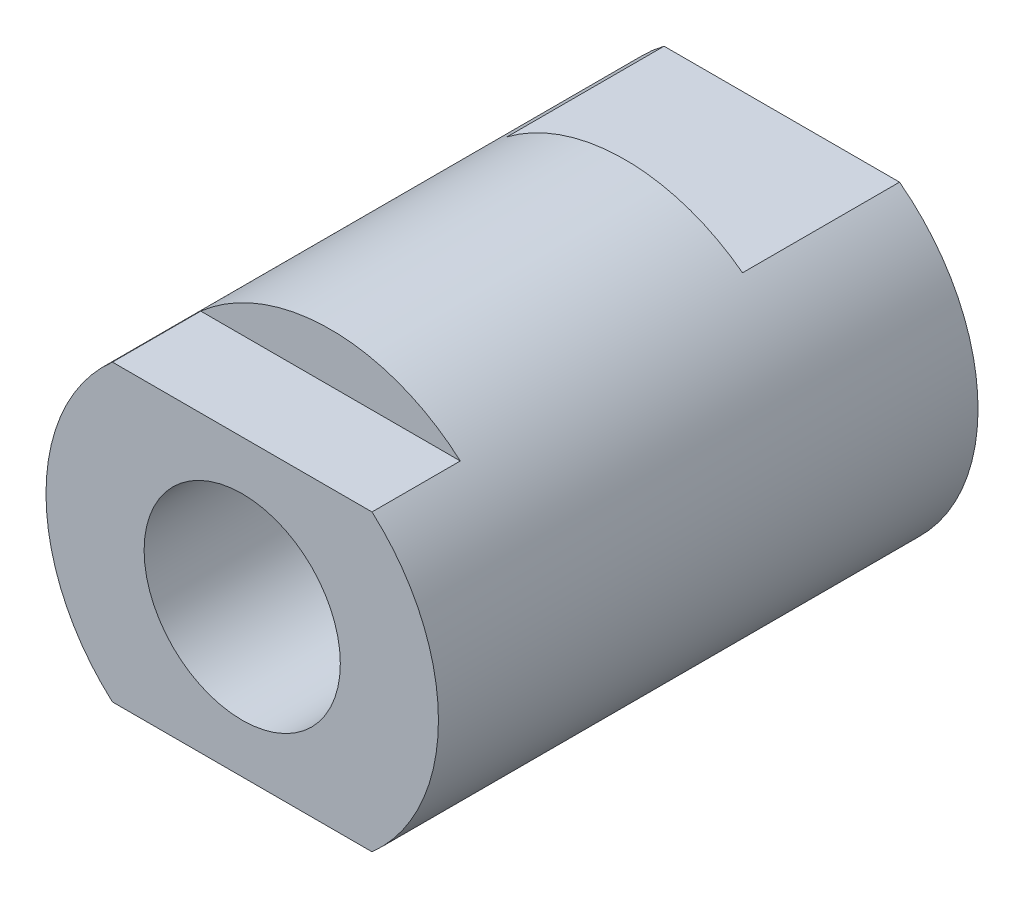
ISO-10303-21;
HEADER;
FILE_DESCRIPTION(('STEP AP214'),'2;1');
FILE_NAME('part.step','',(''),(''),'','','');
FILE_SCHEMA(('AUTOMOTIVE_DESIGN { 1 0 10303 214 1 1 1 1 }'));
ENDSEC;
DATA;
#1=APPLICATION_CONTEXT('core data for automotive mechanical design processes');
#2=APPLICATION_PROTOCOL_DEFINITION('international standard','automotive_design',2000,#1);
#3=PRODUCT_CONTEXT('',#1,'mechanical');
#4=PRODUCT('Part','Part','',(#3));
#5=PRODUCT_RELATED_PRODUCT_CATEGORY('part','',(#4));
#6=PRODUCT_DEFINITION_FORMATION('','',#4);
#7=PRODUCT_DEFINITION_CONTEXT('part definition',#1,'design');
#8=PRODUCT_DEFINITION('design','',#6,#7);
#9=PRODUCT_DEFINITION_SHAPE('','',#8);
#10=(LENGTH_UNIT() NAMED_UNIT(*) SI_UNIT(.MILLI.,.METRE.));
#11=(NAMED_UNIT(*) PLANE_ANGLE_UNIT() SI_UNIT($,.RADIAN.));
#12=(NAMED_UNIT(*) SI_UNIT($,.STERADIAN.) SOLID_ANGLE_UNIT());
#13=UNCERTAINTY_MEASURE_WITH_UNIT(LENGTH_MEASURE(1.E-05),#10,'distance_accuracy_value','');
#14=(GEOMETRIC_REPRESENTATION_CONTEXT(3) GLOBAL_UNCERTAINTY_ASSIGNED_CONTEXT((#13)) GLOBAL_UNIT_ASSIGNED_CONTEXT((#10,
#11,#12)) REPRESENTATION_CONTEXT('',''));
#15=CARTESIAN_POINT('',(0.,0.,0.));
#16=DIRECTION('',(0.,0.,1.));
#17=DIRECTION('',(1.,0.,0.));
#18=AXIS2_PLACEMENT_3D('',#15,#16,#17);
#19=CARTESIAN_POINT('',(0.,0.,5.5));
#20=DIRECTION('',(0.,0.,1.));
#21=DIRECTION('',(1.,0.,0.));
#22=AXIS2_PLACEMENT_3D('',#19,#20,#21);
#23=PLANE('',#22);
#24=CARTESIAN_POINT('',(0.,0.,5.5));
#25=DIRECTION('',(0.,0.,1.));
#26=DIRECTION('',(1.,0.,0.));
#27=AXIS2_PLACEMENT_3D('',#24,#25,#26);
#28=CIRCLE('',#27,1.);
#29=CARTESIAN_POINT('',(1.,0.,5.5));
#30=VERTEX_POINT('',#29);
#31=EDGE_CURVE('E133',#30,#30,#28,.T.);
#32=ORIENTED_EDGE('',*,*,#31,.T.);
#33=EDGE_LOOP('',(#32));
#34=FACE_BOUND('',#33,.T.);
#35=CARTESIAN_POINT('',(0.,0.,5.5));
#36=DIRECTION('',(0.,0.,1.));
#37=DIRECTION('',(1.,0.,0.));
#38=AXIS2_PLACEMENT_3D('',#35,#36,#37);
#39=CIRCLE('',#38,2.);
#40=CARTESIAN_POINT('',(-1.2,1.6,5.5));
#41=VERTEX_POINT('',#40);
#42=CARTESIAN_POINT('',(1.2,1.6,5.5));
#43=VERTEX_POINT('',#42);
#44=EDGE_CURVE('E12',#41,#43,#39,.T.);
#45=ORIENTED_EDGE('',*,*,#44,.F.);
#46=DIRECTION('',(-1.,0.,0.));
#47=VECTOR('',#46,1.);
#48=CARTESIAN_POINT('',(1.2,1.6,5.5));
#49=LINE('',#48,#47);
#50=EDGE_CURVE('E98',#43,#41,#49,.T.);
#51=ORIENTED_EDGE('',*,*,#50,.F.);
#52=EDGE_LOOP('',(#45,#51));
#53=FACE_BOUND('',#52,.T.);
#54=ADVANCED_FACE('F41',(#34,#53),#23,.F.);
#55=CARTESIAN_POINT('',(0.,0.,11.));
#56=DIRECTION('',(0.,0.,-1.));
#57=DIRECTION('',(-1.,0.,0.));
#58=AXIS2_PLACEMENT_3D('',#55,#56,#57);
#59=CYLINDRICAL_SURFACE('',#58,1.);
#60=CARTESIAN_POINT('',(0.,0.,11.));
#61=DIRECTION('',(0.,0.,1.));
#62=DIRECTION('',(1.,0.,0.));
#63=AXIS2_PLACEMENT_3D('',#60,#61,#62);
#64=CIRCLE('',#63,1.);
#65=CARTESIAN_POINT('',(1.,0.,11.));
#66=VERTEX_POINT('',#65);
#67=EDGE_CURVE('E144',#66,#66,#64,.T.);
#68=ORIENTED_EDGE('',*,*,#67,.T.);
#69=EDGE_LOOP('',(#68));
#70=FACE_BOUND('',#69,.T.);
#71=ORIENTED_EDGE('',*,*,#31,.F.);
#72=EDGE_LOOP('',(#71));
#73=FACE_BOUND('',#72,.T.);
#74=ADVANCED_FACE('F214',(#70,#73),#59,.F.);
#75=CARTESIAN_POINT('',(0.,0.,11.));
#76=DIRECTION('',(0.,0.,1.));
#77=DIRECTION('',(1.,0.,0.));
#78=AXIS2_PLACEMENT_3D('',#75,#76,#77);
#79=PLANE('',#78);
#80=DIRECTION('',(-1.,0.,0.));
#81=VECTOR('',#80,1.);
#82=CARTESIAN_POINT('',(1.3228756555323,-1.5,11.));
#83=LINE('',#82,#81);
#84=CARTESIAN_POINT('',(1.3228756555323,-1.5,11.));
#85=VERTEX_POINT('',#84);
#86=CARTESIAN_POINT('',(-1.3228756555323,-1.5,11.));
#87=VERTEX_POINT('',#86);
#88=EDGE_CURVE('E114',#85,#87,#83,.T.);
#89=ORIENTED_EDGE('',*,*,#88,.F.);
#90=CARTESIAN_POINT('',(0.,0.,11.));
#91=DIRECTION('',(0.,0.,1.));
#92=DIRECTION('',(1.,0.,0.));
#93=AXIS2_PLACEMENT_3D('',#90,#91,#92);
#94=CIRCLE('',#93,2.);
#95=CARTESIAN_POINT('',(1.3228756555323,1.5,11.));
#96=VERTEX_POINT('',#95);
#97=EDGE_CURVE('E148',#85,#96,#94,.T.);
#98=ORIENTED_EDGE('',*,*,#97,.T.);
#99=DIRECTION('',(-1.,0.,0.));
#100=VECTOR('',#99,1.);
#101=CARTESIAN_POINT('',(1.3228756555323,1.5,11.));
#102=LINE('',#101,#100);
#103=CARTESIAN_POINT('',(-1.3228756555323,1.5,11.));
#104=VERTEX_POINT('',#103);
#105=EDGE_CURVE('E153',#96,#104,#102,.T.);
#106=ORIENTED_EDGE('',*,*,#105,.T.);
#107=EDGE_CURVE('E149',#104,#87,#94,.T.);
#108=ORIENTED_EDGE('',*,*,#107,.T.);
#109=EDGE_LOOP('',(#89,#98,#106,#108));
#110=FACE_BOUND('',#109,.T.);
#111=ORIENTED_EDGE('',*,*,#67,.F.);
#112=EDGE_LOOP('',(#111));
#113=FACE_BOUND('',#112,.T.);
#114=ADVANCED_FACE('F176',(#110,#113),#79,.T.);
#115=CARTESIAN_POINT('',(0.,0.,10.1));
#116=DIRECTION('',(0.,0.,1.));
#117=DIRECTION('',(1.,0.,0.));
#118=AXIS2_PLACEMENT_3D('',#115,#116,#117);
#119=PLANE('',#118);
#120=DIRECTION('',(-1.,0.,0.));
#121=VECTOR('',#120,1.);
#122=CARTESIAN_POINT('',(1.3228756555323,1.5,10.1));
#123=LINE('',#122,#121);
#124=CARTESIAN_POINT('',(1.3228756555323,1.5,10.1));
#125=VERTEX_POINT('',#124);
#126=CARTESIAN_POINT('',(-1.3228756555323,1.5,10.1));
#127=VERTEX_POINT('',#126);
#128=EDGE_CURVE('E141',#125,#127,#123,.T.);
#129=ORIENTED_EDGE('',*,*,#128,.F.);
#130=CARTESIAN_POINT('',(0.,0.,10.1));
#131=DIRECTION('',(0.,0.,1.));
#132=DIRECTION('',(1.,0.,0.));
#133=AXIS2_PLACEMENT_3D('',#130,#131,#132);
#134=CIRCLE('',#133,2.);
#135=EDGE_CURVE('E137',#125,#127,#134,.T.);
#136=ORIENTED_EDGE('',*,*,#135,.T.);
#137=EDGE_LOOP('',(#129,#136));
#138=FACE_BOUND('',#137,.T.);
#139=ADVANCED_FACE('F172',(#138),#119,.T.);
#140=CARTESIAN_POINT('',(1.3228756555323,1.5,11.));
#141=DIRECTION('',(0.,-1.,0.));
#142=DIRECTION('',(0.,0.,-1.));
#143=AXIS2_PLACEMENT_3D('',#140,#141,#142);
#144=PLANE('',#143);
#145=DIRECTION('',(0.,0.,-1.));
#146=VECTOR('',#145,1.);
#147=CARTESIAN_POINT('',(1.3228756555323,1.5,11.));
#148=LINE('',#147,#146);
#149=EDGE_CURVE('E49',#96,#125,#148,.T.);
#150=ORIENTED_EDGE('',*,*,#149,.T.);
#151=ORIENTED_EDGE('',*,*,#128,.T.);
#152=DIRECTION('',(0.,0.,-1.));
#153=VECTOR('',#152,1.);
#154=CARTESIAN_POINT('',(-1.3228756555323,1.5,11.));
#155=LINE('',#154,#153);
#156=EDGE_CURVE('E156',#104,#127,#155,.T.);
#157=ORIENTED_EDGE('',*,*,#156,.F.);
#158=ORIENTED_EDGE('',*,*,#105,.F.);
#159=EDGE_LOOP('',(#150,#151,#157,#158));
#160=FACE_BOUND('',#159,.T.);
#161=ADVANCED_FACE('F166',(#160),#144,.F.);
#162=CARTESIAN_POINT('',(0.,0.,11.));
#163=DIRECTION('',(0.,0.,-1.));
#164=DIRECTION('',(-1.,0.,0.));
#165=AXIS2_PLACEMENT_3D('',#162,#163,#164);
#166=CYLINDRICAL_SURFACE('',#165,2.);
#167=ORIENTED_EDGE('',*,*,#97,.F.);
#168=DIRECTION('',(0.,0.,1.));
#169=VECTOR('',#168,1.);
#170=CARTESIAN_POINT('',(1.3228756555323,-1.5,7.40741759643275));
#171=LINE('',#170,#169);
#172=CARTESIAN_POINT('',(1.3228756555323,-1.5,10.1));
#173=VERTEX_POINT('',#172);
#174=EDGE_CURVE('E125',#173,#85,#171,.T.);
#175=ORIENTED_EDGE('',*,*,#174,.F.);
#176=CARTESIAN_POINT('',(0.,0.,10.1));
#177=DIRECTION('',(0.,0.,1.));
#178=DIRECTION('',(1.,0.,0.));
#179=AXIS2_PLACEMENT_3D('',#176,#177,#178);
#180=CIRCLE('',#179,2.00000000000004);
#181=CARTESIAN_POINT('',(-1.3228756555323,-1.5,10.1));
#182=VERTEX_POINT('',#181);
#183=EDGE_CURVE('E118',#173,#182,#180,.F.);
#184=ORIENTED_EDGE('',*,*,#183,.T.);
#185=DIRECTION('',(0.,0.,1.));
#186=VECTOR('',#185,1.);
#187=CARTESIAN_POINT('',(-1.3228756555323,-1.5,7.40741759643275));
#188=LINE('',#187,#186);
#189=EDGE_CURVE('E122',#182,#87,#188,.T.);
#190=ORIENTED_EDGE('',*,*,#189,.T.);
#191=ORIENTED_EDGE('',*,*,#107,.F.);
#192=ORIENTED_EDGE('',*,*,#156,.T.);
#193=ORIENTED_EDGE('',*,*,#135,.F.);
#194=ORIENTED_EDGE('',*,*,#149,.F.);
#195=EDGE_LOOP('',(#167,#175,#184,#190,#191,#192,#193,#194));
#196=FACE_BOUND('',#195,.T.);
#197=CARTESIAN_POINT('',(0.,0.,7.1));
#198=DIRECTION('',(0.,0.,-1.));
#199=DIRECTION('',(-1.,0.,0.));
#200=AXIS2_PLACEMENT_3D('',#197,#198,#199);
#201=CIRCLE('',#200,2.);
#202=CARTESIAN_POINT('',(-1.2,1.6,7.1));
#203=VERTEX_POINT('',#202);
#204=CARTESIAN_POINT('',(1.2,1.6,7.1));
#205=VERTEX_POINT('',#204);
#206=EDGE_CURVE('E92',#203,#205,#201,.T.);
#207=ORIENTED_EDGE('',*,*,#206,.F.);
#208=DIRECTION('',(0.,0.,-1.));
#209=VECTOR('',#208,1.);
#210=CARTESIAN_POINT('',(-1.2,1.6,7.1));
#211=LINE('',#210,#209);
#212=EDGE_CURVE('E104',#203,#41,#211,.T.);
#213=ORIENTED_EDGE('',*,*,#212,.T.);
#214=ORIENTED_EDGE('',*,*,#44,.T.);
#215=DIRECTION('',(0.,0.,-1.));
#216=VECTOR('',#215,1.);
#217=CARTESIAN_POINT('',(1.2,1.6,7.1));
#218=LINE('',#217,#216);
#219=EDGE_CURVE('E102',#205,#43,#218,.T.);
#220=ORIENTED_EDGE('',*,*,#219,.F.);
#221=EDGE_LOOP('',(#207,#213,#214,#220));
#222=FACE_BOUND('',#221,.T.);
#223=ADVANCED_FACE('F107',(#196,#222),#166,.T.);
#224=CARTESIAN_POINT('',(1.3228756555323,-1.5,7.40741759643275));
#225=DIRECTION('',(0.,1.,0.));
#226=DIRECTION('',(0.,0.,1.));
#227=AXIS2_PLACEMENT_3D('',#224,#225,#226);
#228=PLANE('',#227);
#229=DIRECTION('',(1.,0.,0.));
#230=VECTOR('',#229,1.);
#231=CARTESIAN_POINT('',(1.3228756555323,-1.5,10.1));
#232=LINE('',#231,#230);
#233=EDGE_CURVE('E62',#182,#173,#232,.T.);
#234=ORIENTED_EDGE('',*,*,#233,.T.);
#235=ORIENTED_EDGE('',*,*,#174,.T.);
#236=ORIENTED_EDGE('',*,*,#88,.T.);
#237=ORIENTED_EDGE('',*,*,#189,.F.);
#238=EDGE_LOOP('',(#234,#235,#236,#237));
#239=FACE_BOUND('',#238,.T.);
#240=ADVANCED_FACE('F221',(#239),#228,.F.);
#241=CARTESIAN_POINT('',(0.,0.,10.1));
#242=DIRECTION('',(0.,0.,1.));
#243=DIRECTION('',(1.,0.,0.));
#244=AXIS2_PLACEMENT_3D('',#241,#242,#243);
#245=PLANE('',#244);
#246=ORIENTED_EDGE('',*,*,#183,.F.);
#247=ORIENTED_EDGE('',*,*,#233,.F.);
#248=EDGE_LOOP('',(#246,#247));
#249=FACE_BOUND('',#248,.T.);
#250=ADVANCED_FACE('F227',(#249),#245,.T.);
#251=CARTESIAN_POINT('',(1.2,1.6,7.1));
#252=DIRECTION('',(0.,-1.,0.));
#253=DIRECTION('',(0.,0.,-1.));
#254=AXIS2_PLACEMENT_3D('',#251,#252,#253);
#255=PLANE('',#254);
#256=ORIENTED_EDGE('',*,*,#50,.T.);
#257=ORIENTED_EDGE('',*,*,#212,.F.);
#258=DIRECTION('',(-1.,0.,0.));
#259=VECTOR('',#258,1.);
#260=CARTESIAN_POINT('',(1.2,1.6,7.1));
#261=LINE('',#260,#259);
#262=EDGE_CURVE('E55',#205,#203,#261,.T.);
#263=ORIENTED_EDGE('',*,*,#262,.F.);
#264=ORIENTED_EDGE('',*,*,#219,.T.);
#265=EDGE_LOOP('',(#256,#257,#263,#264));
#266=FACE_BOUND('',#265,.T.);
#267=ADVANCED_FACE('F101',(#266),#255,.F.);
#268=CARTESIAN_POINT('',(0.,0.,7.1));
#269=DIRECTION('',(0.,0.,-1.));
#270=DIRECTION('',(-1.,0.,0.));
#271=AXIS2_PLACEMENT_3D('',#268,#269,#270);
#272=PLANE('',#271);
#273=ORIENTED_EDGE('',*,*,#206,.T.);
#274=ORIENTED_EDGE('',*,*,#262,.T.);
#275=EDGE_LOOP('',(#273,#274));
#276=FACE_BOUND('',#275,.T.);
#277=ADVANCED_FACE('F93',(#276),#272,.T.);
#278=CLOSED_SHELL('',(#54,#74,#114,#139,#161,#223,#240,#250,#267,#277));
#279=MANIFOLD_SOLID_BREP('B2',#278);
#280=ADVANCED_BREP_SHAPE_REPRESENTATION('',(#18,#279),#14);
#281=SHAPE_DEFINITION_REPRESENTATION(#9,#280);
ENDSEC;
END-ISO-10303-21;
